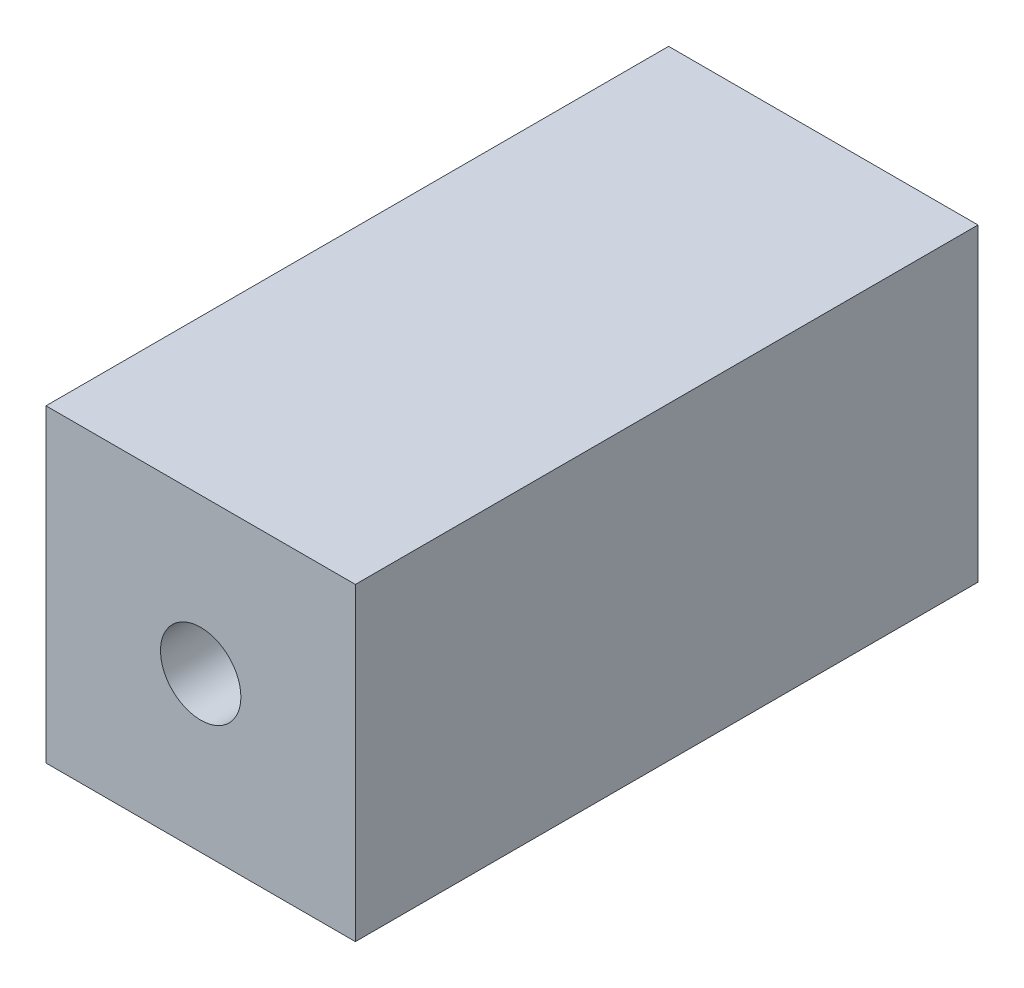
ISO-10303-21;
HEADER;
FILE_DESCRIPTION(('STEP AP214'),'2;1');
FILE_NAME('part.step','',(''),(''),'','','');
FILE_SCHEMA(('AUTOMOTIVE_DESIGN { 1 0 10303 214 1 1 1 1 }'));
ENDSEC;
DATA;
#1=APPLICATION_CONTEXT('core data for automotive mechanical design processes');
#2=APPLICATION_PROTOCOL_DEFINITION('international standard','automotive_design',2000,#1);
#3=PRODUCT_CONTEXT('',#1,'mechanical');
#4=PRODUCT('Part','Part','',(#3));
#5=PRODUCT_RELATED_PRODUCT_CATEGORY('part','',(#4));
#6=PRODUCT_DEFINITION_FORMATION('','',#4);
#7=PRODUCT_DEFINITION_CONTEXT('part definition',#1,'design');
#8=PRODUCT_DEFINITION('design','',#6,#7);
#9=PRODUCT_DEFINITION_SHAPE('','',#8);
#10=(LENGTH_UNIT() NAMED_UNIT(*) SI_UNIT(.MILLI.,.METRE.));
#11=(NAMED_UNIT(*) PLANE_ANGLE_UNIT() SI_UNIT($,.RADIAN.));
#12=(NAMED_UNIT(*) SI_UNIT($,.STERADIAN.) SOLID_ANGLE_UNIT());
#13=UNCERTAINTY_MEASURE_WITH_UNIT(LENGTH_MEASURE(1.E-05),#10,'distance_accuracy_value','');
#14=(GEOMETRIC_REPRESENTATION_CONTEXT(3) GLOBAL_UNCERTAINTY_ASSIGNED_CONTEXT((#13)) GLOBAL_UNIT_ASSIGNED_CONTEXT((#10,
#11,#12)) REPRESENTATION_CONTEXT('',''));
#15=CARTESIAN_POINT('',(0.,0.,0.));
#16=DIRECTION('',(0.,0.,1.));
#17=DIRECTION('',(1.,0.,0.));
#18=AXIS2_PLACEMENT_3D('',#15,#16,#17);
#19=CARTESIAN_POINT('',(12.7,-12.7,25.557792928));
#20=DIRECTION('',(-1.,0.,0.));
#21=DIRECTION('',(0.,0.,1.));
#22=AXIS2_PLACEMENT_3D('',#19,#20,#21);
#23=PLANE('',#22);
#24=DIRECTION('',(0.,1.,0.));
#25=VECTOR('',#24,1.);
#26=CARTESIAN_POINT('',(12.7,-12.7,-25.557792928));
#27=LINE('',#26,#25);
#28=CARTESIAN_POINT('',(12.7,-12.7,-25.557792928));
#29=VERTEX_POINT('',#28);
#30=CARTESIAN_POINT('',(12.7,12.7,-25.557792928));
#31=VERTEX_POINT('',#30);
#32=EDGE_CURVE('E96',#29,#31,#27,.T.);
#33=ORIENTED_EDGE('',*,*,#32,.T.);
#34=DIRECTION('',(0.,0.,-1.));
#35=VECTOR('',#34,1.);
#36=CARTESIAN_POINT('',(12.7,12.7,25.557792928));
#37=LINE('',#36,#35);
#38=CARTESIAN_POINT('',(12.7,12.7,25.557792928));
#39=VERTEX_POINT('',#38);
#40=EDGE_CURVE('E11',#39,#31,#37,.T.);
#41=ORIENTED_EDGE('',*,*,#40,.F.);
#42=DIRECTION('',(0.,1.,0.));
#43=VECTOR('',#42,1.);
#44=CARTESIAN_POINT('',(12.7,-12.7,25.557792928));
#45=LINE('',#44,#43);
#46=CARTESIAN_POINT('',(12.7,-12.7,25.557792928));
#47=VERTEX_POINT('',#46);
#48=EDGE_CURVE('E84',#47,#39,#45,.T.);
#49=ORIENTED_EDGE('',*,*,#48,.F.);
#50=DIRECTION('',(0.,0.,-1.));
#51=VECTOR('',#50,1.);
#52=CARTESIAN_POINT('',(12.7,-12.7,25.557792928));
#53=LINE('',#52,#51);
#54=EDGE_CURVE('E92',#47,#29,#53,.T.);
#55=ORIENTED_EDGE('',*,*,#54,.T.);
#56=EDGE_LOOP('',(#33,#41,#49,#55));
#57=FACE_BOUND('',#56,.T.);
#58=ADVANCED_FACE('F33',(#57),#23,.F.);
#59=CARTESIAN_POINT('',(-12.7,12.7,25.557792928));
#60=DIRECTION('',(0.,-1.,0.));
#61=DIRECTION('',(0.,0.,-1.));
#62=AXIS2_PLACEMENT_3D('',#59,#60,#61);
#63=PLANE('',#62);
#64=DIRECTION('',(-1.,0.,0.));
#65=VECTOR('',#64,1.);
#66=CARTESIAN_POINT('',(-12.7,12.7,-25.557792928));
#67=LINE('',#66,#65);
#68=CARTESIAN_POINT('',(-12.7,12.7,-25.557792928));
#69=VERTEX_POINT('',#68);
#70=EDGE_CURVE('E88',#31,#69,#67,.T.);
#71=ORIENTED_EDGE('',*,*,#70,.T.);
#72=DIRECTION('',(0.,0.,-1.));
#73=VECTOR('',#72,1.);
#74=CARTESIAN_POINT('',(-12.7,12.7,25.557792928));
#75=LINE('',#74,#73);
#76=CARTESIAN_POINT('',(-12.7,12.7,25.557792928));
#77=VERTEX_POINT('',#76);
#78=EDGE_CURVE('E41',#77,#69,#75,.T.);
#79=ORIENTED_EDGE('',*,*,#78,.F.);
#80=DIRECTION('',(-1.,0.,0.));
#81=VECTOR('',#80,1.);
#82=CARTESIAN_POINT('',(-12.7,12.7,25.557792928));
#83=LINE('',#82,#81);
#84=EDGE_CURVE('E79',#39,#77,#83,.T.);
#85=ORIENTED_EDGE('',*,*,#84,.F.);
#86=ORIENTED_EDGE('',*,*,#40,.T.);
#87=EDGE_LOOP('',(#71,#79,#85,#86));
#88=FACE_BOUND('',#87,.T.);
#89=ADVANCED_FACE('F87',(#88),#63,.F.);
#90=CARTESIAN_POINT('',(-12.7,-12.7,25.557792928));
#91=DIRECTION('',(1.,0.,0.));
#92=DIRECTION('',(0.,0.,-1.));
#93=AXIS2_PLACEMENT_3D('',#90,#91,#92);
#94=PLANE('',#93);
#95=DIRECTION('',(0.,-1.,0.));
#96=VECTOR('',#95,1.);
#97=CARTESIAN_POINT('',(-12.7,-12.7,-25.557792928));
#98=LINE('',#97,#96);
#99=CARTESIAN_POINT('',(-12.7,-12.7,-25.557792928));
#100=VERTEX_POINT('',#99);
#101=EDGE_CURVE('E66',#69,#100,#98,.T.);
#102=ORIENTED_EDGE('',*,*,#101,.T.);
#103=DIRECTION('',(0.,0.,-1.));
#104=VECTOR('',#103,1.);
#105=CARTESIAN_POINT('',(-12.7,-12.7,25.557792928));
#106=LINE('',#105,#104);
#107=CARTESIAN_POINT('',(-12.7,-12.7,25.557792928));
#108=VERTEX_POINT('',#107);
#109=EDGE_CURVE('E89',#108,#100,#106,.T.);
#110=ORIENTED_EDGE('',*,*,#109,.F.);
#111=DIRECTION('',(0.,-1.,0.));
#112=VECTOR('',#111,1.);
#113=CARTESIAN_POINT('',(-12.7,-12.7,25.557792928));
#114=LINE('',#113,#112);
#115=EDGE_CURVE('E82',#77,#108,#114,.T.);
#116=ORIENTED_EDGE('',*,*,#115,.F.);
#117=ORIENTED_EDGE('',*,*,#78,.T.);
#118=EDGE_LOOP('',(#102,#110,#116,#117));
#119=FACE_BOUND('',#118,.T.);
#120=ADVANCED_FACE('F90',(#119),#94,.F.);
#121=CARTESIAN_POINT('',(-12.7,-12.7,25.557792928));
#122=DIRECTION('',(0.,1.,0.));
#123=DIRECTION('',(0.,0.,1.));
#124=AXIS2_PLACEMENT_3D('',#121,#122,#123);
#125=PLANE('',#124);
#126=DIRECTION('',(1.,0.,0.));
#127=VECTOR('',#126,1.);
#128=CARTESIAN_POINT('',(-12.7,-12.7,-25.557792928));
#129=LINE('',#128,#127);
#130=EDGE_CURVE('E72',#100,#29,#129,.T.);
#131=ORIENTED_EDGE('',*,*,#130,.T.);
#132=ORIENTED_EDGE('',*,*,#54,.F.);
#133=DIRECTION('',(1.,0.,0.));
#134=VECTOR('',#133,1.);
#135=CARTESIAN_POINT('',(-12.7,-12.7,25.557792928));
#136=LINE('',#135,#134);
#137=EDGE_CURVE('E49',#108,#47,#136,.T.);
#138=ORIENTED_EDGE('',*,*,#137,.F.);
#139=ORIENTED_EDGE('',*,*,#109,.T.);
#140=EDGE_LOOP('',(#131,#132,#138,#139));
#141=FACE_BOUND('',#140,.T.);
#142=ADVANCED_FACE('F104',(#141),#125,.F.);
#143=CARTESIAN_POINT('',(0.,0.,25.557792928));
#144=DIRECTION('',(0.,0.,-1.));
#145=DIRECTION('',(-1.,0.,0.));
#146=AXIS2_PLACEMENT_3D('',#143,#144,#145);
#147=PLANE('',#146);
#148=CARTESIAN_POINT('',(0.,0.,25.557792928));
#149=DIRECTION('',(0.,0.,1.));
#150=DIRECTION('',(1.,0.,0.));
#151=AXIS2_PLACEMENT_3D('',#148,#149,#150);
#152=CIRCLE('',#151,3.300000004);
#153=CARTESIAN_POINT('',(3.300000004,0.,25.557792928));
#154=VERTEX_POINT('',#153);
#155=EDGE_CURVE('E110',#154,#154,#152,.T.);
#156=ORIENTED_EDGE('',*,*,#155,.F.);
#157=EDGE_LOOP('',(#156));
#158=FACE_BOUND('',#157,.T.);
#159=ORIENTED_EDGE('',*,*,#48,.T.);
#160=ORIENTED_EDGE('',*,*,#84,.T.);
#161=ORIENTED_EDGE('',*,*,#115,.T.);
#162=ORIENTED_EDGE('',*,*,#137,.T.);
#163=EDGE_LOOP('',(#159,#160,#161,#162));
#164=FACE_BOUND('',#163,.T.);
#165=ADVANCED_FACE('F80',(#158,#164),#147,.F.);
#166=CARTESIAN_POINT('',(0.,0.,-25.557792928));
#167=DIRECTION('',(0.,0.,-1.));
#168=DIRECTION('',(-1.,0.,0.));
#169=AXIS2_PLACEMENT_3D('',#166,#167,#168);
#170=PLANE('',#169);
#171=CARTESIAN_POINT('',(0.,0.,-25.557792928));
#172=DIRECTION('',(0.,0.,1.));
#173=DIRECTION('',(1.,0.,0.));
#174=AXIS2_PLACEMENT_3D('',#171,#172,#173);
#175=CIRCLE('',#174,3.300000004);
#176=CARTESIAN_POINT('',(3.300000004,0.,-25.557792928));
#177=VERTEX_POINT('',#176);
#178=EDGE_CURVE('E99',#177,#177,#175,.T.);
#179=ORIENTED_EDGE('',*,*,#178,.T.);
#180=EDGE_LOOP('',(#179));
#181=FACE_BOUND('',#180,.T.);
#182=ORIENTED_EDGE('',*,*,#32,.F.);
#183=ORIENTED_EDGE('',*,*,#130,.F.);
#184=ORIENTED_EDGE('',*,*,#101,.F.);
#185=ORIENTED_EDGE('',*,*,#70,.F.);
#186=EDGE_LOOP('',(#182,#183,#184,#185));
#187=FACE_BOUND('',#186,.T.);
#188=ADVANCED_FACE('F107',(#181,#187),#170,.T.);
#189=CARTESIAN_POINT('',(0.,0.,-25.557792928));
#190=DIRECTION('',(0.,0.,1.));
#191=DIRECTION('',(1.,0.,0.));
#192=AXIS2_PLACEMENT_3D('',#189,#190,#191);
#193=CYLINDRICAL_SURFACE('',#192,3.300000004);
#194=ORIENTED_EDGE('',*,*,#178,.F.);
#195=EDGE_LOOP('',(#194));
#196=FACE_BOUND('',#195,.T.);
#197=ORIENTED_EDGE('',*,*,#155,.T.);
#198=EDGE_LOOP('',(#197));
#199=FACE_BOUND('',#198,.T.);
#200=ADVANCED_FACE('F117',(#196,#199),#193,.F.);
#201=CLOSED_SHELL('',(#58,#89,#120,#142,#165,#188,#200));
#202=MANIFOLD_SOLID_BREP('B2',#201);
#203=ADVANCED_BREP_SHAPE_REPRESENTATION('',(#18,#202),#14);
#204=SHAPE_DEFINITION_REPRESENTATION(#9,#203);
ENDSEC;
END-ISO-10303-21;
